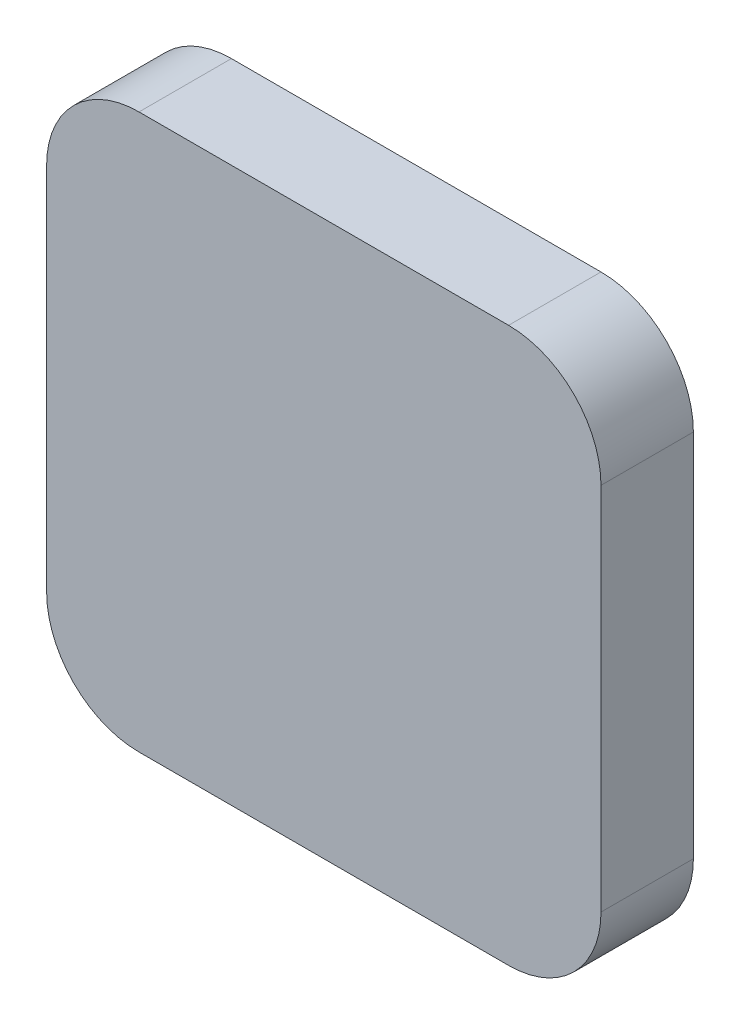
ISO-10303-21;
HEADER;
FILE_DESCRIPTION(('STEP AP214'),'2;1');
FILE_NAME('part.step','',(''),(''),'','','');
FILE_SCHEMA(('AUTOMOTIVE_DESIGN { 1 0 10303 214 1 1 1 1 }'));
ENDSEC;
DATA;
#1=APPLICATION_CONTEXT('core data for automotive mechanical design processes');
#2=APPLICATION_PROTOCOL_DEFINITION('international standard','automotive_design',2000,#1);
#3=PRODUCT_CONTEXT('',#1,'mechanical');
#4=PRODUCT('Part','Part','',(#3));
#5=PRODUCT_RELATED_PRODUCT_CATEGORY('part','',(#4));
#6=PRODUCT_DEFINITION_FORMATION('','',#4);
#7=PRODUCT_DEFINITION_CONTEXT('part definition',#1,'design');
#8=PRODUCT_DEFINITION('design','',#6,#7);
#9=PRODUCT_DEFINITION_SHAPE('','',#8);
#10=(LENGTH_UNIT() NAMED_UNIT(*) SI_UNIT(.MILLI.,.METRE.));
#11=(NAMED_UNIT(*) PLANE_ANGLE_UNIT() SI_UNIT($,.RADIAN.));
#12=(NAMED_UNIT(*) SI_UNIT($,.STERADIAN.) SOLID_ANGLE_UNIT());
#13=UNCERTAINTY_MEASURE_WITH_UNIT(LENGTH_MEASURE(1.E-05),#10,'distance_accuracy_value','');
#14=(GEOMETRIC_REPRESENTATION_CONTEXT(3) GLOBAL_UNCERTAINTY_ASSIGNED_CONTEXT((#13)) GLOBAL_UNIT_ASSIGNED_CONTEXT((#10,
#11,#12)) REPRESENTATION_CONTEXT('',''));
#15=CARTESIAN_POINT('',(0.,0.,0.));
#16=DIRECTION('',(0.,0.,1.));
#17=DIRECTION('',(1.,0.,0.));
#18=AXIS2_PLACEMENT_3D('',#15,#16,#17);
#19=CARTESIAN_POINT('',(-6.,-6.,2.));
#20=DIRECTION('',(1.,0.,0.));
#21=DIRECTION('',(0.,0.,-1.));
#22=AXIS2_PLACEMENT_3D('',#19,#20,#21);
#23=PLANE('',#22);
#24=DIRECTION('',(0.,-1.,0.));
#25=VECTOR('',#24,1.);
#26=CARTESIAN_POINT('',(-6.,-6.,2.));
#27=LINE('',#26,#25);
#28=CARTESIAN_POINT('',(-6.,4.,2.));
#29=VERTEX_POINT('',#28);
#30=CARTESIAN_POINT('',(-6.,-4.,2.));
#31=VERTEX_POINT('',#30);
#32=EDGE_CURVE('E123',#29,#31,#27,.T.);
#33=ORIENTED_EDGE('',*,*,#32,.F.);
#34=DIRECTION('',(0.,0.,-1.));
#35=VECTOR('',#34,1.);
#36=CARTESIAN_POINT('',(-6.,4.,2.));
#37=LINE('',#36,#35);
#38=CARTESIAN_POINT('',(-6.,4.,0.));
#39=VERTEX_POINT('',#38);
#40=EDGE_CURVE('E108',#29,#39,#37,.T.);
#41=ORIENTED_EDGE('',*,*,#40,.T.);
#42=DIRECTION('',(0.,-1.,0.));
#43=VECTOR('',#42,1.);
#44=CARTESIAN_POINT('',(-6.,-6.,0.));
#45=LINE('',#44,#43);
#46=CARTESIAN_POINT('',(-6.,-4.,0.));
#47=VERTEX_POINT('',#46);
#48=EDGE_CURVE('E120',#39,#47,#45,.T.);
#49=ORIENTED_EDGE('',*,*,#48,.T.);
#50=DIRECTION('',(0.,0.,-1.));
#51=VECTOR('',#50,1.);
#52=CARTESIAN_POINT('',(-6.,-4.,2.));
#53=LINE('',#52,#51);
#54=EDGE_CURVE('E125',#47,#31,#53,.F.);
#55=ORIENTED_EDGE('',*,*,#54,.T.);
#56=EDGE_LOOP('',(#33,#41,#49,#55));
#57=FACE_BOUND('',#56,.T.);
#58=ADVANCED_FACE('F38',(#57),#23,.F.);
#59=CARTESIAN_POINT('',(6.,-6.,2.));
#60=DIRECTION('',(0.,1.,0.));
#61=DIRECTION('',(-1.,0.,0.));
#62=AXIS2_PLACEMENT_3D('',#59,#60,#61);
#63=PLANE('',#62);
#64=DIRECTION('',(1.,0.,0.));
#65=VECTOR('',#64,1.);
#66=CARTESIAN_POINT('',(6.,-6.,2.));
#67=LINE('',#66,#65);
#68=CARTESIAN_POINT('',(-4.,-6.,2.));
#69=VERTEX_POINT('',#68);
#70=CARTESIAN_POINT('',(4.,-6.,2.));
#71=VERTEX_POINT('',#70);
#72=EDGE_CURVE('E165',#69,#71,#67,.T.);
#73=ORIENTED_EDGE('',*,*,#72,.F.);
#74=DIRECTION('',(0.,0.,-1.));
#75=VECTOR('',#74,1.);
#76=CARTESIAN_POINT('',(-4.,-6.,2.));
#77=LINE('',#76,#75);
#78=CARTESIAN_POINT('',(-4.,-6.,0.));
#79=VERTEX_POINT('',#78);
#80=EDGE_CURVE('E158',#69,#79,#77,.T.);
#81=ORIENTED_EDGE('',*,*,#80,.T.);
#82=DIRECTION('',(1.,0.,0.));
#83=VECTOR('',#82,1.);
#84=CARTESIAN_POINT('',(6.,-6.,0.));
#85=LINE('',#84,#83);
#86=CARTESIAN_POINT('',(4.,-6.,0.));
#87=VERTEX_POINT('',#86);
#88=EDGE_CURVE('E129',#79,#87,#85,.T.);
#89=ORIENTED_EDGE('',*,*,#88,.T.);
#90=DIRECTION('',(0.,0.,-1.));
#91=VECTOR('',#90,1.);
#92=CARTESIAN_POINT('',(4.,-6.,2.));
#93=LINE('',#92,#91);
#94=EDGE_CURVE('E156',#87,#71,#93,.F.);
#95=ORIENTED_EDGE('',*,*,#94,.T.);
#96=EDGE_LOOP('',(#73,#81,#89,#95));
#97=FACE_BOUND('',#96,.T.);
#98=ADVANCED_FACE('F163',(#97),#63,.F.);
#99=CARTESIAN_POINT('',(6.,-6.,2.));
#100=DIRECTION('',(-1.,0.,0.));
#101=DIRECTION('',(0.,0.,1.));
#102=AXIS2_PLACEMENT_3D('',#99,#100,#101);
#103=PLANE('',#102);
#104=DIRECTION('',(0.,1.,0.));
#105=VECTOR('',#104,1.);
#106=CARTESIAN_POINT('',(6.,-6.,2.));
#107=LINE('',#106,#105);
#108=CARTESIAN_POINT('',(6.,-4.,2.));
#109=VERTEX_POINT('',#108);
#110=CARTESIAN_POINT('',(6.,4.,2.));
#111=VERTEX_POINT('',#110);
#112=EDGE_CURVE('E173',#109,#111,#107,.T.);
#113=ORIENTED_EDGE('',*,*,#112,.F.);
#114=DIRECTION('',(0.,0.,-1.));
#115=VECTOR('',#114,1.);
#116=CARTESIAN_POINT('',(6.,-4.,2.));
#117=LINE('',#116,#115);
#118=CARTESIAN_POINT('',(6.,-4.,0.));
#119=VERTEX_POINT('',#118);
#120=EDGE_CURVE('E11',#109,#119,#117,.T.);
#121=ORIENTED_EDGE('',*,*,#120,.T.);
#122=DIRECTION('',(0.,1.,0.));
#123=VECTOR('',#122,1.);
#124=CARTESIAN_POINT('',(6.,-6.,0.));
#125=LINE('',#124,#123);
#126=CARTESIAN_POINT('',(6.,4.,0.));
#127=VERTEX_POINT('',#126);
#128=EDGE_CURVE('E132',#119,#127,#125,.T.);
#129=ORIENTED_EDGE('',*,*,#128,.T.);
#130=DIRECTION('',(0.,0.,-1.));
#131=VECTOR('',#130,1.);
#132=CARTESIAN_POINT('',(6.,4.,2.));
#133=LINE('',#132,#131);
#134=EDGE_CURVE('E46',#127,#111,#133,.F.);
#135=ORIENTED_EDGE('',*,*,#134,.T.);
#136=EDGE_LOOP('',(#113,#121,#129,#135));
#137=FACE_BOUND('',#136,.T.);
#138=ADVANCED_FACE('F172',(#137),#103,.F.);
#139=CARTESIAN_POINT('',(6.,6.,2.));
#140=DIRECTION('',(0.,-1.,0.));
#141=DIRECTION('',(1.,0.,0.));
#142=AXIS2_PLACEMENT_3D('',#139,#140,#141);
#143=PLANE('',#142);
#144=DIRECTION('',(-1.,0.,0.));
#145=VECTOR('',#144,1.);
#146=CARTESIAN_POINT('',(6.,6.,0.));
#147=LINE('',#146,#145);
#148=CARTESIAN_POINT('',(4.,6.,0.));
#149=VERTEX_POINT('',#148);
#150=CARTESIAN_POINT('',(-4.,6.,0.));
#151=VERTEX_POINT('',#150);
#152=EDGE_CURVE('E139',#149,#151,#147,.T.);
#153=ORIENTED_EDGE('',*,*,#152,.T.);
#154=DIRECTION('',(0.,0.,-1.));
#155=VECTOR('',#154,1.);
#156=CARTESIAN_POINT('',(-4.,6.,2.));
#157=LINE('',#156,#155);
#158=CARTESIAN_POINT('',(-4.,6.,2.));
#159=VERTEX_POINT('',#158);
#160=EDGE_CURVE('E109',#151,#159,#157,.F.);
#161=ORIENTED_EDGE('',*,*,#160,.T.);
#162=DIRECTION('',(-1.,0.,0.));
#163=VECTOR('',#162,1.);
#164=CARTESIAN_POINT('',(6.,6.,2.));
#165=LINE('',#164,#163);
#166=CARTESIAN_POINT('',(4.,6.,2.));
#167=VERTEX_POINT('',#166);
#168=EDGE_CURVE('E135',#167,#159,#165,.T.);
#169=ORIENTED_EDGE('',*,*,#168,.F.);
#170=DIRECTION('',(0.,0.,-1.));
#171=VECTOR('',#170,1.);
#172=CARTESIAN_POINT('',(4.,6.,2.));
#173=LINE('',#172,#171);
#174=EDGE_CURVE('E114',#167,#149,#173,.T.);
#175=ORIENTED_EDGE('',*,*,#174,.T.);
#176=EDGE_LOOP('',(#153,#161,#169,#175));
#177=FACE_BOUND('',#176,.T.);
#178=ADVANCED_FACE('F196',(#177),#143,.F.);
#179=CARTESIAN_POINT('',(0.,0.,2.));
#180=DIRECTION('',(0.,0.,1.));
#181=DIRECTION('',(1.,0.,0.));
#182=AXIS2_PLACEMENT_3D('',#179,#180,#181);
#183=PLANE('',#182);
#184=ORIENTED_EDGE('',*,*,#168,.T.);
#185=CARTESIAN_POINT('',(-4.,4.,2.));
#186=DIRECTION('',(0.,0.,1.));
#187=DIRECTION('',(1.,0.,0.));
#188=AXIS2_PLACEMENT_3D('',#185,#186,#187);
#189=CIRCLE('',#188,2.);
#190=EDGE_CURVE('E154',#159,#29,#189,.T.);
#191=ORIENTED_EDGE('',*,*,#190,.T.);
#192=ORIENTED_EDGE('',*,*,#32,.T.);
#193=CARTESIAN_POINT('',(-4.,-4.,2.));
#194=DIRECTION('',(0.,0.,1.));
#195=DIRECTION('',(1.,0.,0.));
#196=AXIS2_PLACEMENT_3D('',#193,#194,#195);
#197=CIRCLE('',#196,2.);
#198=EDGE_CURVE('E152',#31,#69,#197,.T.);
#199=ORIENTED_EDGE('',*,*,#198,.T.);
#200=ORIENTED_EDGE('',*,*,#72,.T.);
#201=CARTESIAN_POINT('',(4.,-4.,2.));
#202=DIRECTION('',(0.,0.,1.));
#203=DIRECTION('',(1.,0.,0.));
#204=AXIS2_PLACEMENT_3D('',#201,#202,#203);
#205=CIRCLE('',#204,2.);
#206=EDGE_CURVE('E59',#71,#109,#205,.T.);
#207=ORIENTED_EDGE('',*,*,#206,.T.);
#208=ORIENTED_EDGE('',*,*,#112,.T.);
#209=CARTESIAN_POINT('',(4.,4.,2.));
#210=DIRECTION('',(0.,0.,1.));
#211=DIRECTION('',(1.,0.,0.));
#212=AXIS2_PLACEMENT_3D('',#209,#210,#211);
#213=CIRCLE('',#212,2.);
#214=EDGE_CURVE('E149',#111,#167,#213,.T.);
#215=ORIENTED_EDGE('',*,*,#214,.T.);
#216=EDGE_LOOP('',(#184,#191,#192,#199,#200,#207,#208,#215));
#217=FACE_BOUND('',#216,.T.);
#218=ADVANCED_FACE('F178',(#217),#183,.T.);
#219=CARTESIAN_POINT('',(0.,0.,0.));
#220=DIRECTION('',(0.,0.,1.));
#221=DIRECTION('',(1.,0.,0.));
#222=AXIS2_PLACEMENT_3D('',#219,#220,#221);
#223=PLANE('',#222);
#224=ORIENTED_EDGE('',*,*,#48,.F.);
#225=CARTESIAN_POINT('',(-4.,4.,0.));
#226=DIRECTION('',(0.,0.,1.));
#227=DIRECTION('',(1.,0.,0.));
#228=AXIS2_PLACEMENT_3D('',#225,#226,#227);
#229=CIRCLE('',#228,2.);
#230=EDGE_CURVE('E104',#39,#151,#229,.F.);
#231=ORIENTED_EDGE('',*,*,#230,.T.);
#232=ORIENTED_EDGE('',*,*,#152,.F.);
#233=CARTESIAN_POINT('',(4.,4.,0.));
#234=DIRECTION('',(0.,0.,1.));
#235=DIRECTION('',(1.,0.,0.));
#236=AXIS2_PLACEMENT_3D('',#233,#234,#235);
#237=CIRCLE('',#236,2.);
#238=EDGE_CURVE('E124',#149,#127,#237,.F.);
#239=ORIENTED_EDGE('',*,*,#238,.T.);
#240=ORIENTED_EDGE('',*,*,#128,.F.);
#241=CARTESIAN_POINT('',(4.,-4.,0.));
#242=DIRECTION('',(0.,0.,1.));
#243=DIRECTION('',(1.,0.,0.));
#244=AXIS2_PLACEMENT_3D('',#241,#242,#243);
#245=CIRCLE('',#244,2.);
#246=EDGE_CURVE('E143',#119,#87,#245,.F.);
#247=ORIENTED_EDGE('',*,*,#246,.T.);
#248=ORIENTED_EDGE('',*,*,#88,.F.);
#249=CARTESIAN_POINT('',(-4.,-4.,0.));
#250=DIRECTION('',(0.,0.,1.));
#251=DIRECTION('',(1.,0.,0.));
#252=AXIS2_PLACEMENT_3D('',#249,#250,#251);
#253=CIRCLE('',#252,2.);
#254=EDGE_CURVE('E115',#79,#47,#253,.F.);
#255=ORIENTED_EDGE('',*,*,#254,.T.);
#256=EDGE_LOOP('',(#224,#231,#232,#239,#240,#247,#248,#255));
#257=FACE_BOUND('',#256,.T.);
#258=ADVANCED_FACE('F127',(#257),#223,.F.);
#259=CARTESIAN_POINT('',(-4.,4.,2.));
#260=DIRECTION('',(0.,0.,-1.));
#261=DIRECTION('',(-1.,0.,0.));
#262=AXIS2_PLACEMENT_3D('',#259,#260,#261);
#263=CYLINDRICAL_SURFACE('',#262,2.);
#264=ORIENTED_EDGE('',*,*,#190,.F.);
#265=ORIENTED_EDGE('',*,*,#160,.F.);
#266=ORIENTED_EDGE('',*,*,#230,.F.);
#267=ORIENTED_EDGE('',*,*,#40,.F.);
#268=EDGE_LOOP('',(#264,#265,#266,#267));
#269=FACE_BOUND('',#268,.T.);
#270=ADVANCED_FACE('F107',(#269),#263,.T.);
#271=CARTESIAN_POINT('',(-4.,-4.,2.));
#272=DIRECTION('',(0.,0.,-1.));
#273=DIRECTION('',(-1.,0.,0.));
#274=AXIS2_PLACEMENT_3D('',#271,#272,#273);
#275=CYLINDRICAL_SURFACE('',#274,2.);
#276=ORIENTED_EDGE('',*,*,#198,.F.);
#277=ORIENTED_EDGE('',*,*,#54,.F.);
#278=ORIENTED_EDGE('',*,*,#254,.F.);
#279=ORIENTED_EDGE('',*,*,#80,.F.);
#280=EDGE_LOOP('',(#276,#277,#278,#279));
#281=FACE_BOUND('',#280,.T.);
#282=ADVANCED_FACE('F179',(#281),#275,.T.);
#283=CARTESIAN_POINT('',(4.,-4.,2.));
#284=DIRECTION('',(0.,0.,-1.));
#285=DIRECTION('',(-1.,0.,0.));
#286=AXIS2_PLACEMENT_3D('',#283,#284,#285);
#287=CYLINDRICAL_SURFACE('',#286,2.);
#288=ORIENTED_EDGE('',*,*,#206,.F.);
#289=ORIENTED_EDGE('',*,*,#94,.F.);
#290=ORIENTED_EDGE('',*,*,#246,.F.);
#291=ORIENTED_EDGE('',*,*,#120,.F.);
#292=EDGE_LOOP('',(#288,#289,#290,#291));
#293=FACE_BOUND('',#292,.T.);
#294=ADVANCED_FACE('F171',(#293),#287,.T.);
#295=CARTESIAN_POINT('',(4.,4.,2.));
#296=DIRECTION('',(0.,0.,-1.));
#297=DIRECTION('',(-1.,0.,0.));
#298=AXIS2_PLACEMENT_3D('',#295,#296,#297);
#299=CYLINDRICAL_SURFACE('',#298,2.);
#300=ORIENTED_EDGE('',*,*,#214,.F.);
#301=ORIENTED_EDGE('',*,*,#134,.F.);
#302=ORIENTED_EDGE('',*,*,#238,.F.);
#303=ORIENTED_EDGE('',*,*,#174,.F.);
#304=EDGE_LOOP('',(#300,#301,#302,#303));
#305=FACE_BOUND('',#304,.T.);
#306=ADVANCED_FACE('F40',(#305),#299,.T.);
#307=CLOSED_SHELL('',(#58,#98,#138,#178,#218,#258,#270,#282,#294,#306));
#308=MANIFOLD_SOLID_BREP('B2',#307);
#309=ADVANCED_BREP_SHAPE_REPRESENTATION('',(#18,#308),#14);
#310=SHAPE_DEFINITION_REPRESENTATION(#9,#309);
ENDSEC;
END-ISO-10303-21;
